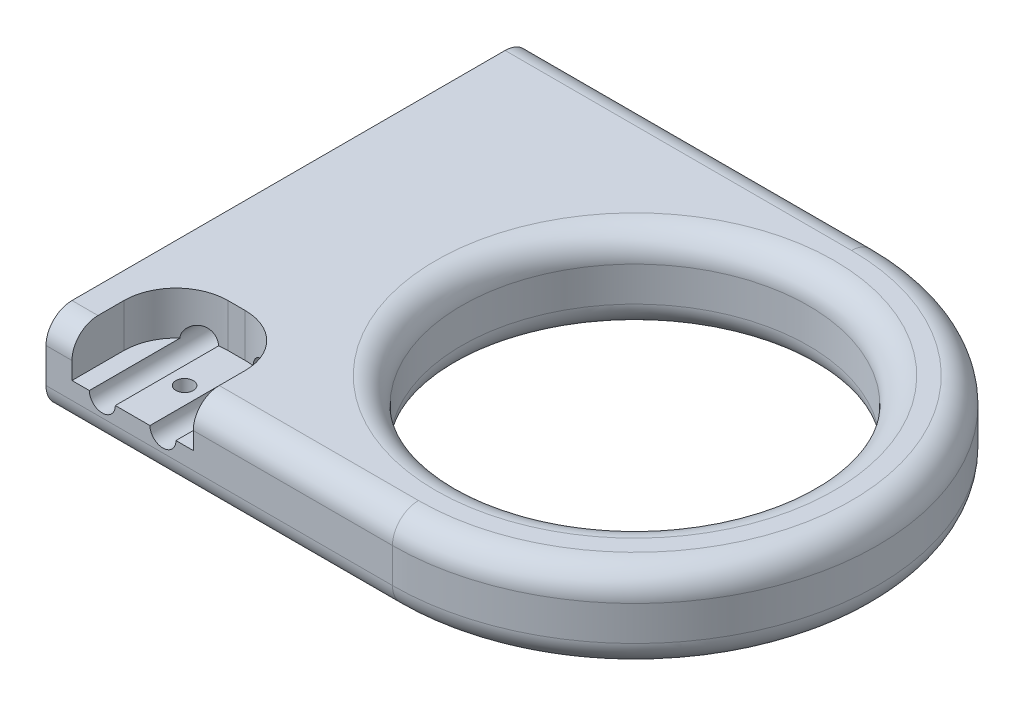
ISO-10303-21;
HEADER;
FILE_DESCRIPTION(('STEP AP214'),'2;1');
FILE_NAME('part.step','',(''),(''),'','','');
FILE_SCHEMA(('AUTOMOTIVE_DESIGN { 1 0 10303 214 1 1 1 1 }'));
ENDSEC;
DATA;
#1=APPLICATION_CONTEXT('core data for automotive mechanical design processes');
#2=APPLICATION_PROTOCOL_DEFINITION('international standard','automotive_design',2000,#1);
#3=PRODUCT_CONTEXT('',#1,'mechanical');
#4=PRODUCT('Part','Part','',(#3));
#5=PRODUCT_RELATED_PRODUCT_CATEGORY('part','',(#4));
#6=PRODUCT_DEFINITION_FORMATION('','',#4);
#7=PRODUCT_DEFINITION_CONTEXT('part definition',#1,'design');
#8=PRODUCT_DEFINITION('design','',#6,#7);
#9=PRODUCT_DEFINITION_SHAPE('','',#8);
#10=(LENGTH_UNIT() NAMED_UNIT(*) SI_UNIT(.MILLI.,.METRE.));
#11=(NAMED_UNIT(*) PLANE_ANGLE_UNIT() SI_UNIT($,.RADIAN.));
#12=(NAMED_UNIT(*) SI_UNIT($,.STERADIAN.) SOLID_ANGLE_UNIT());
#13=UNCERTAINTY_MEASURE_WITH_UNIT(LENGTH_MEASURE(1.E-05),#10,'distance_accuracy_value','');
#14=(GEOMETRIC_REPRESENTATION_CONTEXT(3) GLOBAL_UNCERTAINTY_ASSIGNED_CONTEXT((#13)) GLOBAL_UNIT_ASSIGNED_CONTEXT((#10,
#11,#12)) REPRESENTATION_CONTEXT('',''));
#15=CARTESIAN_POINT('',(0.,0.,0.));
#16=DIRECTION('',(0.,0.,1.));
#17=DIRECTION('',(1.,0.,0.));
#18=AXIS2_PLACEMENT_3D('',#15,#16,#17);
#19=CARTESIAN_POINT('',(0.,2.5,0.));
#20=DIRECTION('',(0.,1.,0.));
#21=DIRECTION('',(0.,0.,1.));
#22=AXIS2_PLACEMENT_3D('',#19,#20,#21);
#23=PLANE('',#22);
#24=DIRECTION('',(0.,0.,1.));
#25=VECTOR('',#24,1.);
#26=CARTESIAN_POINT('',(-20.,2.5,14.));
#27=LINE('',#26,#25);
#28=CARTESIAN_POINT('',(-20.,2.5,-12.5));
#29=VERTEX_POINT('',#28);
#30=CARTESIAN_POINT('',(-20.,2.5,12.5));
#31=VERTEX_POINT('',#30);
#32=EDGE_CURVE('E212',#29,#31,#27,.T.);
#33=ORIENTED_EDGE('',*,*,#32,.T.);
#34=DIRECTION('',(1.,0.,0.));
#35=VECTOR('',#34,1.);
#36=CARTESIAN_POINT('',(-18.5,2.5,12.5));
#37=LINE('',#36,#35);
#38=CARTESIAN_POINT('',(-18.5,2.5,12.5));
#39=VERTEX_POINT('',#38);
#40=EDGE_CURVE('E268',#31,#39,#37,.T.);
#41=ORIENTED_EDGE('',*,*,#40,.T.);
#42=DIRECTION('',(0.,0.,1.));
#43=VECTOR('',#42,1.);
#44=CARTESIAN_POINT('',(-18.5,2.5,8.));
#45=LINE('',#44,#43);
#46=CARTESIAN_POINT('',(-18.5,2.5,11.));
#47=VERTEX_POINT('',#46);
#48=EDGE_CURVE('E438',#47,#39,#45,.T.);
#49=ORIENTED_EDGE('',*,*,#48,.F.);
#50=CARTESIAN_POINT('',(-15.5,2.5,11.));
#51=DIRECTION('',(0.,1.,0.));
#52=DIRECTION('',(0.,0.,1.));
#53=AXIS2_PLACEMENT_3D('',#50,#51,#52);
#54=CIRCLE('',#53,3.);
#55=CARTESIAN_POINT('',(-15.5,2.5,8.));
#56=VERTEX_POINT('',#55);
#57=EDGE_CURVE('E11',#47,#56,#54,.F.);
#58=ORIENTED_EDGE('',*,*,#57,.T.);
#59=DIRECTION('',(-1.,0.,0.));
#60=VECTOR('',#59,1.);
#61=CARTESIAN_POINT('',(0.,2.5,8.));
#62=LINE('',#61,#60);
#63=CARTESIAN_POINT('',(-14.5,2.5,8.));
#64=VERTEX_POINT('',#63);
#65=EDGE_CURVE('E184',#64,#56,#62,.T.);
#66=ORIENTED_EDGE('',*,*,#65,.F.);
#67=CARTESIAN_POINT('',(-14.5,2.5,11.));
#68=DIRECTION('',(0.,1.,0.));
#69=DIRECTION('',(0.,0.,1.));
#70=AXIS2_PLACEMENT_3D('',#67,#68,#69);
#71=CIRCLE('',#70,3.);
#72=CARTESIAN_POINT('',(-11.5,2.5,11.));
#73=VERTEX_POINT('',#72);
#74=EDGE_CURVE('E319',#64,#73,#71,.F.);
#75=ORIENTED_EDGE('',*,*,#74,.T.);
#76=DIRECTION('',(0.,0.,1.));
#77=VECTOR('',#76,1.);
#78=CARTESIAN_POINT('',(-11.5,2.5,8.));
#79=LINE('',#78,#77);
#80=CARTESIAN_POINT('',(-11.5,2.5,12.5));
#81=VERTEX_POINT('',#80);
#82=EDGE_CURVE('E440',#73,#81,#79,.T.);
#83=ORIENTED_EDGE('',*,*,#82,.T.);
#84=DIRECTION('',(1.,0.,0.));
#85=VECTOR('',#84,1.);
#86=CARTESIAN_POINT('',(0.,2.5,12.5));
#87=LINE('',#86,#85);
#88=CARTESIAN_POINT('',(0.,2.5,12.5));
#89=VERTEX_POINT('',#88);
#90=EDGE_CURVE('E265',#81,#89,#87,.T.);
#91=ORIENTED_EDGE('',*,*,#90,.T.);
#92=CARTESIAN_POINT('',(0.,2.5,0.));
#93=DIRECTION('',(0.,1.,0.));
#94=DIRECTION('',(0.,0.,1.));
#95=AXIS2_PLACEMENT_3D('',#92,#93,#94);
#96=CIRCLE('',#95,12.5);
#97=CARTESIAN_POINT('',(0.,2.5,-12.5));
#98=VERTEX_POINT('',#97);
#99=EDGE_CURVE('E261',#89,#98,#96,.T.);
#100=ORIENTED_EDGE('',*,*,#99,.T.);
#101=DIRECTION('',(-1.,0.,0.));
#102=VECTOR('',#101,1.);
#103=CARTESIAN_POINT('',(-20.,2.5,-12.5));
#104=LINE('',#103,#102);
#105=EDGE_CURVE('E263',#98,#29,#104,.T.);
#106=ORIENTED_EDGE('',*,*,#105,.T.);
#107=EDGE_LOOP('',(#33,#41,#49,#58,#66,#75,#83,#91,#100,#106));
#108=FACE_BOUND('',#107,.T.);
#109=CARTESIAN_POINT('',(0.,2.5,0.));
#110=DIRECTION('',(0.,1.,0.));
#111=DIRECTION('',(0.,0.,1.));
#112=AXIS2_PLACEMENT_3D('',#109,#110,#111);
#113=CIRCLE('',#112,11.5);
#114=CARTESIAN_POINT('',(0.,2.5,11.5));
#115=VERTEX_POINT('',#114);
#116=EDGE_CURVE('E258',#115,#115,#113,.F.);
#117=ORIENTED_EDGE('',*,*,#116,.T.);
#118=EDGE_LOOP('',(#117));
#119=FACE_BOUND('',#118,.T.);
#120=ADVANCED_FACE('F41',(#108,#119),#23,.T.);
#121=CARTESIAN_POINT('',(0.,-2.5,0.));
#122=DIRECTION('',(0.,1.,0.));
#123=DIRECTION('',(0.,0.,1.));
#124=AXIS2_PLACEMENT_3D('',#121,#122,#123);
#125=PLANE('',#124);
#126=CARTESIAN_POINT('',(0.,-2.5,0.));
#127=DIRECTION('',(0.,1.,0.));
#128=DIRECTION('',(0.,0.,1.));
#129=AXIS2_PLACEMENT_3D('',#126,#127,#128);
#130=CIRCLE('',#129,11.5);
#131=CARTESIAN_POINT('',(0.,-2.5,11.5));
#132=VERTEX_POINT('',#131);
#133=EDGE_CURVE('E237',#132,#132,#130,.T.);
#134=ORIENTED_EDGE('',*,*,#133,.T.);
#135=EDGE_LOOP('',(#134));
#136=FACE_BOUND('',#135,.T.);
#137=CARTESIAN_POINT('',(-15.,-2.5,11.));
#138=DIRECTION('',(0.,1.,0.));
#139=DIRECTION('',(-1.,0.,0.));
#140=AXIS2_PLACEMENT_3D('',#137,#138,#139);
#141=CIRCLE('',#140,0.500000000000001);
#142=CARTESIAN_POINT('',(-15.5,-2.5,11.));
#143=VERTEX_POINT('',#142);
#144=EDGE_CURVE('E195',#143,#143,#141,.T.);
#145=ORIENTED_EDGE('',*,*,#144,.T.);
#146=EDGE_LOOP('',(#145));
#147=FACE_BOUND('',#146,.T.);
#148=CARTESIAN_POINT('',(0.,-2.5,0.));
#149=DIRECTION('',(0.,1.,0.));
#150=DIRECTION('',(0.,0.,1.));
#151=AXIS2_PLACEMENT_3D('',#148,#149,#150);
#152=CIRCLE('',#151,12.5);
#153=CARTESIAN_POINT('',(0.,-2.5,-12.5));
#154=VERTEX_POINT('',#153);
#155=CARTESIAN_POINT('',(0.,-2.5,12.5));
#156=VERTEX_POINT('',#155);
#157=EDGE_CURVE('E240',#154,#156,#152,.F.);
#158=ORIENTED_EDGE('',*,*,#157,.T.);
#159=DIRECTION('',(1.,0.,0.));
#160=VECTOR('',#159,1.);
#161=CARTESIAN_POINT('',(0.,-2.5,12.5));
#162=LINE('',#161,#160);
#163=CARTESIAN_POINT('',(-20.,-2.5,12.5));
#164=VERTEX_POINT('',#163);
#165=EDGE_CURVE('E244',#156,#164,#162,.F.);
#166=ORIENTED_EDGE('',*,*,#165,.T.);
#167=DIRECTION('',(0.,0.,1.));
#168=VECTOR('',#167,1.);
#169=CARTESIAN_POINT('',(-20.,-2.5,14.));
#170=LINE('',#169,#168);
#171=CARTESIAN_POINT('',(-20.,-2.5,-12.5));
#172=VERTEX_POINT('',#171);
#173=EDGE_CURVE('E216',#172,#164,#170,.T.);
#174=ORIENTED_EDGE('',*,*,#173,.F.);
#175=DIRECTION('',(-1.,0.,0.));
#176=VECTOR('',#175,1.);
#177=CARTESIAN_POINT('',(0.,-2.5,-12.5));
#178=LINE('',#177,#176);
#179=EDGE_CURVE('E242',#172,#154,#178,.F.);
#180=ORIENTED_EDGE('',*,*,#179,.T.);
#181=EDGE_LOOP('',(#158,#166,#174,#180));
#182=FACE_BOUND('',#181,.T.);
#183=ADVANCED_FACE('F369',(#136,#147,#182),#125,.F.);
#184=CARTESIAN_POINT('',(0.,2.5,0.));
#185=DIRECTION('',(0.,-1.,0.));
#186=DIRECTION('',(0.,0.,-1.));
#187=AXIS2_PLACEMENT_3D('',#184,#185,#186);
#188=CYLINDRICAL_SURFACE('',#187,14.);
#189=DIRECTION('',(0.,-1.,0.));
#190=VECTOR('',#189,1.);
#191=CARTESIAN_POINT('',(0.,2.5,14.));
#192=LINE('',#191,#190);
#193=CARTESIAN_POINT('',(0.,1.,14.));
#194=VERTEX_POINT('',#193);
#195=CARTESIAN_POINT('',(0.,-1.,14.));
#196=VERTEX_POINT('',#195);
#197=EDGE_CURVE('E215',#194,#196,#192,.T.);
#198=ORIENTED_EDGE('',*,*,#197,.T.);
#199=CARTESIAN_POINT('',(0.,-1.,0.));
#200=DIRECTION('',(0.,1.,0.));
#201=DIRECTION('',(0.,0.,1.));
#202=AXIS2_PLACEMENT_3D('',#199,#200,#201);
#203=CIRCLE('',#202,14.);
#204=CARTESIAN_POINT('',(0.,-1.,-14.));
#205=VERTEX_POINT('',#204);
#206=EDGE_CURVE('E278',#196,#205,#203,.T.);
#207=ORIENTED_EDGE('',*,*,#206,.T.);
#208=DIRECTION('',(0.,-1.,0.));
#209=VECTOR('',#208,1.);
#210=CARTESIAN_POINT('',(0.,2.5,-14.));
#211=LINE('',#210,#209);
#212=CARTESIAN_POINT('',(0.,1.,-14.));
#213=VERTEX_POINT('',#212);
#214=EDGE_CURVE('E227',#213,#205,#211,.T.);
#215=ORIENTED_EDGE('',*,*,#214,.F.);
#216=CARTESIAN_POINT('',(0.,1.,0.));
#217=DIRECTION('',(0.,1.,0.));
#218=DIRECTION('',(0.,0.,1.));
#219=AXIS2_PLACEMENT_3D('',#216,#217,#218);
#220=CIRCLE('',#219,14.);
#221=EDGE_CURVE('E276',#213,#194,#220,.F.);
#222=ORIENTED_EDGE('',*,*,#221,.T.);
#223=EDGE_LOOP('',(#198,#207,#215,#222));
#224=FACE_BOUND('',#223,.T.);
#225=ADVANCED_FACE('F365',(#224),#188,.T.);
#226=CARTESIAN_POINT('',(-20.,2.5,-14.));
#227=DIRECTION('',(0.,0.,1.));
#228=DIRECTION('',(1.,0.,0.));
#229=AXIS2_PLACEMENT_3D('',#226,#227,#228);
#230=PLANE('',#229);
#231=CARTESIAN_POINT('',(-16.75,0.,-14.));
#232=DIRECTION('',(0.,0.,1.));
#233=DIRECTION('',(1.,0.,0.));
#234=AXIS2_PLACEMENT_3D('',#231,#232,#233);
#235=CIRCLE('',#234,0.750000000000002);
#236=CARTESIAN_POINT('',(-16.,0.,-14.));
#237=VERTEX_POINT('',#236);
#238=EDGE_CURVE('E219',#237,#237,#235,.T.);
#239=ORIENTED_EDGE('',*,*,#238,.T.);
#240=EDGE_LOOP('',(#239));
#241=FACE_BOUND('',#240,.T.);
#242=CARTESIAN_POINT('',(-13.25,0.,-14.));
#243=DIRECTION('',(0.,0.,1.));
#244=DIRECTION('',(1.,0.,0.));
#245=AXIS2_PLACEMENT_3D('',#242,#243,#244);
#246=CIRCLE('',#245,0.75);
#247=CARTESIAN_POINT('',(-12.5,0.,-14.));
#248=VERTEX_POINT('',#247);
#249=EDGE_CURVE('E203',#248,#248,#246,.T.);
#250=ORIENTED_EDGE('',*,*,#249,.T.);
#251=EDGE_LOOP('',(#250));
#252=FACE_BOUND('',#251,.T.);
#253=ORIENTED_EDGE('',*,*,#214,.T.);
#254=DIRECTION('',(-1.,0.,0.));
#255=VECTOR('',#254,1.);
#256=CARTESIAN_POINT('',(-20.,-1.,-14.));
#257=LINE('',#256,#255);
#258=CARTESIAN_POINT('',(-20.,-1.,-14.));
#259=VERTEX_POINT('',#258);
#260=EDGE_CURVE('E256',#205,#259,#257,.T.);
#261=ORIENTED_EDGE('',*,*,#260,.T.);
#262=DIRECTION('',(0.,-1.,0.));
#263=VECTOR('',#262,1.);
#264=CARTESIAN_POINT('',(-20.,2.5,-14.));
#265=LINE('',#264,#263);
#266=CARTESIAN_POINT('',(-20.,1.,-14.));
#267=VERTEX_POINT('',#266);
#268=EDGE_CURVE('E224',#267,#259,#265,.T.);
#269=ORIENTED_EDGE('',*,*,#268,.F.);
#270=DIRECTION('',(-1.,0.,0.));
#271=VECTOR('',#270,1.);
#272=CARTESIAN_POINT('',(0.,1.,-14.));
#273=LINE('',#272,#271);
#274=EDGE_CURVE('E254',#267,#213,#273,.F.);
#275=ORIENTED_EDGE('',*,*,#274,.T.);
#276=EDGE_LOOP('',(#253,#261,#269,#275));
#277=FACE_BOUND('',#276,.T.);
#278=ADVANCED_FACE('F368',(#241,#252,#277),#230,.F.);
#279=CARTESIAN_POINT('',(-20.,2.5,14.));
#280=DIRECTION('',(1.,0.,0.));
#281=DIRECTION('',(0.,0.,-1.));
#282=AXIS2_PLACEMENT_3D('',#279,#280,#281);
#283=PLANE('',#282);
#284=ORIENTED_EDGE('',*,*,#173,.T.);
#285=CARTESIAN_POINT('',(-20.,-1.,12.5));
#286=DIRECTION('',(1.,0.,0.));
#287=DIRECTION('',(0.,0.,-1.));
#288=AXIS2_PLACEMENT_3D('',#285,#286,#287);
#289=CIRCLE('',#288,1.5);
#290=CARTESIAN_POINT('',(-20.,-1.,14.));
#291=VERTEX_POINT('',#290);
#292=EDGE_CURVE('E252',#164,#291,#289,.F.);
#293=ORIENTED_EDGE('',*,*,#292,.T.);
#294=DIRECTION('',(0.,-1.,0.));
#295=VECTOR('',#294,1.);
#296=CARTESIAN_POINT('',(-20.,2.5,14.));
#297=LINE('',#296,#295);
#298=CARTESIAN_POINT('',(-20.,1.,14.));
#299=VERTEX_POINT('',#298);
#300=EDGE_CURVE('E222',#299,#291,#297,.T.);
#301=ORIENTED_EDGE('',*,*,#300,.F.);
#302=CARTESIAN_POINT('',(-20.,1.,12.5));
#303=DIRECTION('',(1.,0.,0.));
#304=DIRECTION('',(0.,0.,-1.));
#305=AXIS2_PLACEMENT_3D('',#302,#303,#304);
#306=CIRCLE('',#305,1.5);
#307=EDGE_CURVE('E246',#299,#31,#306,.F.);
#308=ORIENTED_EDGE('',*,*,#307,.T.);
#309=ORIENTED_EDGE('',*,*,#32,.F.);
#310=CARTESIAN_POINT('',(-20.,1.,-12.5));
#311=DIRECTION('',(1.,0.,0.));
#312=DIRECTION('',(0.,0.,-1.));
#313=AXIS2_PLACEMENT_3D('',#310,#311,#312);
#314=CIRCLE('',#313,1.5);
#315=EDGE_CURVE('E248',#29,#267,#314,.F.);
#316=ORIENTED_EDGE('',*,*,#315,.T.);
#317=ORIENTED_EDGE('',*,*,#268,.T.);
#318=CARTESIAN_POINT('',(-20.,-1.,-12.5));
#319=DIRECTION('',(1.,0.,0.));
#320=DIRECTION('',(0.,0.,-1.));
#321=AXIS2_PLACEMENT_3D('',#318,#319,#320);
#322=CIRCLE('',#321,1.5);
#323=EDGE_CURVE('E250',#259,#172,#322,.F.);
#324=ORIENTED_EDGE('',*,*,#323,.T.);
#325=EDGE_LOOP('',(#284,#293,#301,#308,#309,#316,#317,#324));
#326=FACE_BOUND('',#325,.T.);
#327=ADVANCED_FACE('F373',(#326),#283,.F.);
#328=CARTESIAN_POINT('',(0.,2.5,14.));
#329=DIRECTION('',(0.,0.,-1.));
#330=DIRECTION('',(-1.,0.,0.));
#331=AXIS2_PLACEMENT_3D('',#328,#329,#330);
#332=PLANE('',#331);
#333=ORIENTED_EDGE('',*,*,#300,.T.);
#334=DIRECTION('',(1.,0.,0.));
#335=VECTOR('',#334,1.);
#336=CARTESIAN_POINT('',(0.,-1.,14.));
#337=LINE('',#336,#335);
#338=EDGE_CURVE('E234',#291,#196,#337,.T.);
#339=ORIENTED_EDGE('',*,*,#338,.T.);
#340=ORIENTED_EDGE('',*,*,#197,.F.);
#341=DIRECTION('',(1.,0.,0.));
#342=VECTOR('',#341,1.);
#343=CARTESIAN_POINT('',(-11.5,1.,14.));
#344=LINE('',#343,#342);
#345=CARTESIAN_POINT('',(-11.5,1.,14.));
#346=VERTEX_POINT('',#345);
#347=EDGE_CURVE('E232',#194,#346,#344,.F.);
#348=ORIENTED_EDGE('',*,*,#347,.T.);
#349=DIRECTION('',(0.,-1.,0.));
#350=VECTOR('',#349,1.);
#351=CARTESIAN_POINT('',(-11.5,0.,14.));
#352=LINE('',#351,#350);
#353=CARTESIAN_POINT('',(-11.5,0.,14.));
#354=VERTEX_POINT('',#353);
#355=EDGE_CURVE('E423',#346,#354,#352,.T.);
#356=ORIENTED_EDGE('',*,*,#355,.T.);
#357=DIRECTION('',(1.,0.,0.));
#358=VECTOR('',#357,1.);
#359=CARTESIAN_POINT('',(0.,0.,14.));
#360=LINE('',#359,#358);
#361=CARTESIAN_POINT('',(-12.5,0.,14.));
#362=VERTEX_POINT('',#361);
#363=EDGE_CURVE('E194',#362,#354,#360,.T.);
#364=ORIENTED_EDGE('',*,*,#363,.F.);
#365=CARTESIAN_POINT('',(-13.25,0.,14.));
#366=DIRECTION('',(0.,0.,1.));
#367=DIRECTION('',(1.,0.,0.));
#368=AXIS2_PLACEMENT_3D('',#365,#366,#367);
#369=CIRCLE('',#368,0.75);
#370=CARTESIAN_POINT('',(-14.,0.,14.));
#371=VERTEX_POINT('',#370);
#372=EDGE_CURVE('E178',#371,#362,#369,.T.);
#373=ORIENTED_EDGE('',*,*,#372,.F.);
#374=DIRECTION('',(1.,0.,0.));
#375=VECTOR('',#374,1.);
#376=CARTESIAN_POINT('',(0.,0.,14.));
#377=LINE('',#376,#375);
#378=CARTESIAN_POINT('',(-16.,0.,14.));
#379=VERTEX_POINT('',#378);
#380=EDGE_CURVE('E187',#379,#371,#377,.T.);
#381=ORIENTED_EDGE('',*,*,#380,.F.);
#382=CARTESIAN_POINT('',(-16.75,0.,14.));
#383=DIRECTION('',(0.,0.,1.));
#384=DIRECTION('',(1.,0.,0.));
#385=AXIS2_PLACEMENT_3D('',#382,#383,#384);
#386=CIRCLE('',#385,0.750000000000002);
#387=CARTESIAN_POINT('',(-17.5,0.,14.));
#388=VERTEX_POINT('',#387);
#389=EDGE_CURVE('E206',#388,#379,#386,.T.);
#390=ORIENTED_EDGE('',*,*,#389,.F.);
#391=CARTESIAN_POINT('',(-18.5,0.,14.));
#392=VERTEX_POINT('',#391);
#393=EDGE_CURVE('E197',#392,#388,#377,.T.);
#394=ORIENTED_EDGE('',*,*,#393,.F.);
#395=DIRECTION('',(0.,-1.,0.));
#396=VECTOR('',#395,1.);
#397=CARTESIAN_POINT('',(-18.5,0.,14.));
#398=LINE('',#397,#396);
#399=CARTESIAN_POINT('',(-18.5,1.,14.));
#400=VERTEX_POINT('',#399);
#401=EDGE_CURVE('E429',#400,#392,#398,.T.);
#402=ORIENTED_EDGE('',*,*,#401,.F.);
#403=DIRECTION('',(1.,0.,0.));
#404=VECTOR('',#403,1.);
#405=CARTESIAN_POINT('',(-20.,1.,14.));
#406=LINE('',#405,#404);
#407=EDGE_CURVE('E230',#400,#299,#406,.F.);
#408=ORIENTED_EDGE('',*,*,#407,.T.);
#409=EDGE_LOOP('',(#333,#339,#340,#348,#356,#364,#373,#381,#390,#394,#402,#408));
#410=FACE_BOUND('',#409,.T.);
#411=ADVANCED_FACE('F200',(#410),#332,.F.);
#412=CARTESIAN_POINT('',(0.,2.5,0.));
#413=DIRECTION('',(0.,-1.,0.));
#414=DIRECTION('',(0.,0.,-1.));
#415=AXIS2_PLACEMENT_3D('',#412,#413,#414);
#416=CYLINDRICAL_SURFACE('',#415,10.);
#417=CARTESIAN_POINT('',(0.,-1.,0.));
#418=DIRECTION('',(0.,1.,0.));
#419=DIRECTION('',(0.,0.,1.));
#420=AXIS2_PLACEMENT_3D('',#417,#418,#419);
#421=CIRCLE('',#420,10.);
#422=CARTESIAN_POINT('',(0.,-1.,10.));
#423=VERTEX_POINT('',#422);
#424=EDGE_CURVE('E283',#423,#423,#421,.F.);
#425=ORIENTED_EDGE('',*,*,#424,.T.);
#426=EDGE_LOOP('',(#425));
#427=FACE_BOUND('',#426,.T.);
#428=CARTESIAN_POINT('',(0.,1.,0.));
#429=DIRECTION('',(0.,1.,0.));
#430=DIRECTION('',(0.,0.,1.));
#431=AXIS2_PLACEMENT_3D('',#428,#429,#430);
#432=CIRCLE('',#431,10.);
#433=CARTESIAN_POINT('',(0.,1.,10.));
#434=VERTEX_POINT('',#433);
#435=EDGE_CURVE('E280',#434,#434,#432,.T.);
#436=ORIENTED_EDGE('',*,*,#435,.T.);
#437=EDGE_LOOP('',(#436));
#438=FACE_BOUND('',#437,.T.);
#439=ADVANCED_FACE('F380',(#427,#438),#416,.F.);
#440=CARTESIAN_POINT('',(-13.25,0.,-14.));
#441=DIRECTION('',(0.,0.,1.));
#442=DIRECTION('',(1.,0.,0.));
#443=AXIS2_PLACEMENT_3D('',#440,#441,#442);
#444=CYLINDRICAL_SURFACE('',#443,0.75);
#445=ORIENTED_EDGE('',*,*,#249,.F.);
#446=EDGE_LOOP('',(#445));
#447=FACE_BOUND('',#446,.T.);
#448=DIRECTION('',(0.,0.,1.));
#449=VECTOR('',#448,1.);
#450=CARTESIAN_POINT('',(-12.5,0.,8.));
#451=LINE('',#450,#449);
#452=CARTESIAN_POINT('',(-12.5,0.,8.76393202250021));
#453=VERTEX_POINT('',#452);
#454=EDGE_CURVE('E183',#453,#362,#451,.T.);
#455=ORIENTED_EDGE('',*,*,#454,.F.);
#456=CARTESIAN_POINT('',(-12.5,0.,8.76393202250021));
#457=CARTESIAN_POINT('',(-12.4999976379572,0.0177987631022406,8.76393576302756));
#458=CARTESIAN_POINT('',(-12.5006340741588,0.0355862737600019,8.76336476359866));
#459=CARTESIAN_POINT('',(-12.5031565789653,0.0709857279100747,8.76111170732881));
#460=CARTESIAN_POINT('',(-12.5050415071525,0.0885978167505462,8.75943066444577));
#461=CARTESIAN_POINT('',(-12.512479264493,0.140643022087186,8.75282251881752));
#462=CARTESIAN_POINT('',(-12.5198163489391,0.174644359799823,8.74632875579237));
#463=CARTESIAN_POINT('',(-12.5387368989977,0.240363164732001,8.72984570325058));
#464=CARTESIAN_POINT('',(-12.5503062618047,0.272087803171147,8.71986802780091));
#465=CARTESIAN_POINT('',(-12.5771401847884,0.332971495275426,8.69719307018776));
#466=CARTESIAN_POINT('',(-12.5924149798095,0.362123132452162,8.68448826676196));
#467=CARTESIAN_POINT('',(-12.6327091507,0.428352847876702,8.65178135757734));
#468=CARTESIAN_POINT('',(-12.6592048081762,0.464082764598928,8.63086667730026));
#469=CARTESIAN_POINT('',(-12.7172023316992,0.529667252665866,8.58691889752557));
#470=CARTESIAN_POINT('',(-12.7487091931333,0.559515894116087,8.56388369395219));
#471=CARTESIAN_POINT('',(-12.8163965517051,0.613502872866567,8.51661412216044));
#472=CARTESIAN_POINT('',(-12.8526345771777,0.637558380331181,8.49236773679339));
#473=CARTESIAN_POINT('',(-12.9287536968737,0.679102998822258,8.44398352357866));
#474=CARTESIAN_POINT('',(-12.9686346391882,0.696592383499511,8.41984569124835));
#475=CARTESIAN_POINT('',(-13.0558467536484,0.726047479737102,8.36994177559665));
#476=CARTESIAN_POINT('',(-13.1035167141137,0.737207417880847,8.34428340273958));
#477=CARTESIAN_POINT('',(-13.2012365077772,0.750031197545146,8.29515274565076));
#478=CARTESIAN_POINT('',(-13.2512858571888,0.751696961202218,8.27168001987198));
#479=CARTESIAN_POINT('',(-13.3485504236228,0.744981012078136,8.2292993191665));
#480=CARTESIAN_POINT('',(-13.395722678221,0.737285204793155,8.21018805450269));
#481=CARTESIAN_POINT('',(-13.488788550022,0.712594489688562,8.17512519839466));
#482=CARTESIAN_POINT('',(-13.534683351344,0.695608516891703,8.15917059101094));
#483=CARTESIAN_POINT('',(-13.6179260391346,0.654996255320426,8.13231163401468));
#484=CARTESIAN_POINT('',(-13.6556464015408,0.63237579390944,8.12103525687754));
#485=CARTESIAN_POINT('',(-13.726961931802,0.580473138345576,8.10107203018892));
#486=CARTESIAN_POINT('',(-13.7605589192491,0.551193899017767,8.09238403598378));
#487=CARTESIAN_POINT('',(-13.820156945703,0.489028269385154,8.0778958470068));
#488=CARTESIAN_POINT('',(-13.8465196345753,0.456523753502134,8.0719391855354));
#489=CARTESIAN_POINT('',(-13.8935750407578,0.38737505312661,8.06183216445581));
#490=CARTESIAN_POINT('',(-13.9142665088296,0.350729959067193,8.05768220270343));
#491=CARTESIAN_POINT('',(-13.9489993457137,0.274974900163798,8.05098216269121));
#492=CARTESIAN_POINT('',(-13.9631384273355,0.235911709730646,8.04840837939158));
#493=CARTESIAN_POINT('',(-13.9847640707698,0.155979056095566,8.04455422083765));
#494=CARTESIAN_POINT('',(-13.992261120011,0.115112547751803,8.04327180613948));
#495=CARTESIAN_POINT('',(-13.9987858596575,0.049353642839278,8.04216689777373));
#496=CARTESIAN_POINT('',(-14.0000104239145,0.0246699565011223,8.04196410139742));
#497=CARTESIAN_POINT('',(-14.,0.,8.04196010845015));
#498=B_SPLINE_CURVE_WITH_KNOTS('',3,(#456,#457,#458,#459,#460,#461,#462,#463,#464,#465,#466,
#467,#468,#469,#470,#471,#472,#473,#474,#475,#476,#477,#478,#479,#480,#481,#482,#483,#484,#485,
#486,#487,#488,#489,#490,#491,#492,#493,#494,#495,#496,#497),.UNSPECIFIED.,.F.,.F.,(4,2,2,2,2,2,
2,2,2,2,2,2,2,2,2,2,2,2,2,2,4),(0.,0.0533546976625298,0.106660726311965,0.212211890417141,
0.317414493683834,0.422911055583677,0.569590489281765,0.71641706658489,0.865232579352205,
1.0140418893716,1.17900603833889,1.34393678841705,1.49747790350954,1.65087160604583,
1.78637044900429,1.92180928142332,2.04801685358894,2.1742522040565,2.2985391529095,
2.42262950748565,2.49664432446835),.UNSPECIFIED.);
#499=CARTESIAN_POINT('',(-14.,0.,8.04196010845019));
#500=VERTEX_POINT('',#499);
#501=EDGE_CURVE('E180',#453,#500,#498,.T.);
#502=ORIENTED_EDGE('',*,*,#501,.T.);
#503=DIRECTION('',(0.,0.,1.));
#504=VECTOR('',#503,1.);
#505=CARTESIAN_POINT('',(-14.,0.,8.));
#506=LINE('',#505,#504);
#507=EDGE_CURVE('E173',#500,#371,#506,.T.);
#508=ORIENTED_EDGE('',*,*,#507,.T.);
#509=ORIENTED_EDGE('',*,*,#372,.T.);
#510=EDGE_LOOP('',(#455,#502,#508,#509));
#511=FACE_BOUND('',#510,.T.);
#512=ADVANCED_FACE('F176',(#447,#511),#444,.F.);
#513=CARTESIAN_POINT('',(-16.75,0.,-14.));
#514=DIRECTION('',(0.,0.,1.));
#515=DIRECTION('',(1.,0.,0.));
#516=AXIS2_PLACEMENT_3D('',#513,#514,#515);
#517=CYLINDRICAL_SURFACE('',#516,0.750000000000002);
#518=ORIENTED_EDGE('',*,*,#389,.T.);
#519=DIRECTION('',(0.,0.,1.));
#520=VECTOR('',#519,1.);
#521=CARTESIAN_POINT('',(-16.,0.,8.));
#522=LINE('',#521,#520);
#523=CARTESIAN_POINT('',(-16.,0.,8.04196010845019));
#524=VERTEX_POINT('',#523);
#525=EDGE_CURVE('E190',#524,#379,#522,.T.);
#526=ORIENTED_EDGE('',*,*,#525,.F.);
#527=CARTESIAN_POINT('',(-16.,0.,8.04196010845019));
#528=CARTESIAN_POINT('',(-15.9999615590836,0.0415439605884963,8.04197854667591));
#529=CARTESIAN_POINT('',(-16.0034495068427,0.0830788500486704,8.04254361961867));
#530=CARTESIAN_POINT('',(-16.017198873237,0.164950996122467,8.04490389975844));
#531=CARTESIAN_POINT('',(-16.0274561140343,0.205288975403367,8.04669834824171));
#532=CARTESIAN_POINT('',(-16.054472946127,0.283663797907529,8.05165531405546));
#533=CARTESIAN_POINT('',(-16.0712361708209,0.321699341543945,8.05481859595236));
#534=CARTESIAN_POINT('',(-16.1107076484959,0.394350870007961,8.06274918536806));
#535=CARTESIAN_POINT('',(-16.1334140926701,0.428967890848687,8.06751600497907));
#536=CARTESIAN_POINT('',(-16.1839692547604,0.493755176820111,8.07889525550238));
#537=CARTESIAN_POINT('',(-16.2118073190689,0.523934425907254,8.08550387699265));
#538=CARTESIAN_POINT('',(-16.2717097696676,0.579135150870098,8.10079015795954));
#539=CARTESIAN_POINT('',(-16.3037746189467,0.604156060946441,8.10946804418134));
#540=CARTESIAN_POINT('',(-16.3712050202953,0.648577529112543,8.12907005638634));
#541=CARTESIAN_POINT('',(-16.4065864649097,0.667948983982495,8.14000533483476));
#542=CARTESIAN_POINT('',(-16.4793388645463,0.700594876953742,8.16409388893356));
#543=CARTESIAN_POINT('',(-16.5167099550632,0.713868899226056,8.17724731577227));
#544=CARTESIAN_POINT('',(-16.5937469946081,0.734667749602953,8.20617243458747));
#545=CARTESIAN_POINT('',(-16.6334462772549,0.741956104613067,8.22202434782454));
#546=CARTESIAN_POINT('',(-16.7126673474462,0.750129343721199,8.2556798558759));
#547=CARTESIAN_POINT('',(-16.7521890695843,0.751012035109535,8.27348411687755));
#548=CARTESIAN_POINT('',(-16.8335356607137,0.746540235307534,8.31227157331425));
#549=CARTESIAN_POINT('',(-16.8752621810598,0.740637011961718,8.33339656804577));
#550=CARTESIAN_POINT('',(-16.9565409353415,0.722204980471011,8.37690673790357));
#551=CARTESIAN_POINT('',(-16.9960918571047,0.70967222118262,8.39929265741292));
#552=CARTESIAN_POINT('',(-17.076613365351,0.67670086668351,8.44721269828909));
#553=CARTESIAN_POINT('',(-17.1172433359801,0.655531644696374,8.47281773071213));
#554=CARTESIAN_POINT('',(-17.1941590738474,0.606065014567919,8.52372205847828));
#555=CARTESIAN_POINT('',(-17.2304433204192,0.577765121934379,8.54902124403074));
#556=CARTESIAN_POINT('',(-17.2939714600713,0.517954604001768,8.59520670292955));
#557=CARTESIAN_POINT('',(-17.3217740200832,0.487173077635074,8.61626791557181));
#558=CARTESIAN_POINT('',(-17.3725006008281,0.420410605035808,8.65590647093942));
#559=CARTESIAN_POINT('',(-17.3954307600773,0.384436298118362,8.67448692794883));
#560=CARTESIAN_POINT('',(-17.4309546690755,0.316129752723465,8.70395429523281));
#561=CARTESIAN_POINT('',(-17.4447127912071,0.284747127718343,8.71563409681178));
#562=CARTESIAN_POINT('',(-17.4679950040582,0.219491617866504,8.73566084512907));
#563=CARTESIAN_POINT('',(-17.4775303753966,0.18562565291709,8.7440166653649));
#564=CARTESIAN_POINT('',(-17.4896965888818,0.126390624864204,8.75474837896353));
#565=CARTESIAN_POINT('',(-17.493533325278,0.101452138347468,8.75816026032103));
#566=CARTESIAN_POINT('',(-17.4986972947288,0.0510202528932441,8.76276677637883));
#567=CARTESIAN_POINT('',(-17.500014812301,0.0255250876189459,8.76395282673602));
#568=CARTESIAN_POINT('',(-17.5,0.,8.76393202250021));
#569=B_SPLINE_CURVE_WITH_KNOTS('',3,(#527,#528,#529,#530,#531,#532,#533,#534,#535,#536,#537,
#538,#539,#540,#541,#542,#543,#544,#545,#546,#547,#548,#549,#550,#551,#552,#553,#554,#555,#556,
#557,#558,#559,#560,#561,#562,#563,#564,#565,#566,#567,#568),.UNSPECIFIED.,.F.,.F.,(4,2,2,2,2,2,
2,2,2,2,2,2,2,2,2,2,2,2,2,2,4),(0.,0.124469180840729,0.248861614175123,0.373323617178901,
0.497747784380883,0.621916489369511,0.746098806731977,0.870909985859659,0.995729675520576,
1.12527100770805,1.25485668083465,1.39570446925498,1.5366362964198,1.6934184646474,
1.85025533516589,1.98928935737454,2.12814716454565,2.23634585118713,2.34425372708004,
2.42042320258184,2.49688584130296),.UNSPECIFIED.);
#570=CARTESIAN_POINT('',(-17.5,0.,8.76393202250021));
#571=VERTEX_POINT('',#570);
#572=EDGE_CURVE('E50',#524,#571,#569,.T.);
#573=ORIENTED_EDGE('',*,*,#572,.T.);
#574=DIRECTION('',(0.,0.,1.));
#575=VECTOR('',#574,1.);
#576=CARTESIAN_POINT('',(-17.5,0.,8.));
#577=LINE('',#576,#575);
#578=EDGE_CURVE('E208',#571,#388,#577,.T.);
#579=ORIENTED_EDGE('',*,*,#578,.T.);
#580=EDGE_LOOP('',(#518,#526,#573,#579));
#581=FACE_BOUND('',#580,.T.);
#582=ORIENTED_EDGE('',*,*,#238,.F.);
#583=EDGE_LOOP('',(#582));
#584=FACE_BOUND('',#583,.T.);
#585=ADVANCED_FACE('F391',(#581,#584),#517,.F.);
#586=CARTESIAN_POINT('',(0.,0.,8.));
#587=DIRECTION('',(0.,-1.,0.));
#588=DIRECTION('',(1.,0.,0.));
#589=AXIS2_PLACEMENT_3D('',#586,#587,#588);
#590=PLANE('',#589);
#591=CARTESIAN_POINT('',(-15.,0.,11.));
#592=DIRECTION('',(0.,1.,0.));
#593=DIRECTION('',(-1.,0.,0.));
#594=AXIS2_PLACEMENT_3D('',#591,#592,#593);
#595=CIRCLE('',#594,0.500000000000001);
#596=CARTESIAN_POINT('',(-15.5,0.,11.));
#597=VERTEX_POINT('',#596);
#598=EDGE_CURVE('E293',#597,#597,#595,.T.);
#599=ORIENTED_EDGE('',*,*,#598,.F.);
#600=EDGE_LOOP('',(#599));
#601=FACE_BOUND('',#600,.T.);
#602=ORIENTED_EDGE('',*,*,#507,.F.);
#603=CARTESIAN_POINT('',(-14.5,0.,11.));
#604=DIRECTION('',(0.,-1.,0.));
#605=DIRECTION('',(1.,0.,0.));
#606=AXIS2_PLACEMENT_3D('',#603,#604,#605);
#607=CIRCLE('',#606,3.);
#608=CARTESIAN_POINT('',(-14.5,0.,8.));
#609=VERTEX_POINT('',#608);
#610=EDGE_CURVE('E304',#500,#609,#607,.F.);
#611=ORIENTED_EDGE('',*,*,#610,.T.);
#612=DIRECTION('',(1.,0.,0.));
#613=VECTOR('',#612,1.);
#614=CARTESIAN_POINT('',(0.,0.,8.));
#615=LINE('',#614,#613);
#616=CARTESIAN_POINT('',(-15.5,0.,8.));
#617=VERTEX_POINT('',#616);
#618=EDGE_CURVE('E452',#617,#609,#615,.T.);
#619=ORIENTED_EDGE('',*,*,#618,.F.);
#620=CARTESIAN_POINT('',(-15.5,0.,11.));
#621=DIRECTION('',(0.,-1.,0.));
#622=DIRECTION('',(1.,0.,0.));
#623=AXIS2_PLACEMENT_3D('',#620,#621,#622);
#624=CIRCLE('',#623,3.);
#625=EDGE_CURVE('E302',#617,#524,#624,.F.);
#626=ORIENTED_EDGE('',*,*,#625,.T.);
#627=ORIENTED_EDGE('',*,*,#525,.T.);
#628=ORIENTED_EDGE('',*,*,#380,.T.);
#629=EDGE_LOOP('',(#602,#611,#619,#626,#627,#628));
#630=FACE_BOUND('',#629,.T.);
#631=ADVANCED_FACE('F188',(#601,#630),#590,.F.);
#632=ORIENTED_EDGE('',*,*,#578,.F.);
#633=CARTESIAN_POINT('',(-15.5,0.,11.));
#634=DIRECTION('',(0.,-1.,0.));
#635=DIRECTION('',(1.,0.,0.));
#636=AXIS2_PLACEMENT_3D('',#633,#634,#635);
#637=CIRCLE('',#636,3.);
#638=CARTESIAN_POINT('',(-18.5,0.,11.));
#639=VERTEX_POINT('',#638);
#640=EDGE_CURVE('E65',#571,#639,#637,.F.);
#641=ORIENTED_EDGE('',*,*,#640,.T.);
#642=DIRECTION('',(0.,0.,1.));
#643=VECTOR('',#642,1.);
#644=CARTESIAN_POINT('',(-18.5,0.,8.));
#645=LINE('',#644,#643);
#646=EDGE_CURVE('E436',#639,#392,#645,.T.);
#647=ORIENTED_EDGE('',*,*,#646,.T.);
#648=ORIENTED_EDGE('',*,*,#393,.T.);
#649=EDGE_LOOP('',(#632,#641,#647,#648));
#650=FACE_BOUND('',#649,.T.);
#651=ADVANCED_FACE('F464',(#650),#590,.F.);
#652=CARTESIAN_POINT('',(-18.5,0.,8.));
#653=DIRECTION('',(-1.,0.,0.));
#654=DIRECTION('',(0.,0.,1.));
#655=AXIS2_PLACEMENT_3D('',#652,#653,#654);
#656=PLANE('',#655);
#657=ORIENTED_EDGE('',*,*,#646,.F.);
#658=DIRECTION('',(0.,-1.,0.));
#659=VECTOR('',#658,1.);
#660=CARTESIAN_POINT('',(-18.5,0.,11.));
#661=LINE('',#660,#659);
#662=EDGE_CURVE('E57',#639,#47,#661,.F.);
#663=ORIENTED_EDGE('',*,*,#662,.T.);
#664=ORIENTED_EDGE('',*,*,#48,.T.);
#665=CARTESIAN_POINT('',(-18.5,1.,12.5));
#666=DIRECTION('',(-1.,0.,0.));
#667=DIRECTION('',(0.,0.,1.));
#668=AXIS2_PLACEMENT_3D('',#665,#666,#667);
#669=CIRCLE('',#668,1.5);
#670=EDGE_CURVE('E274',#39,#400,#669,.F.);
#671=ORIENTED_EDGE('',*,*,#670,.T.);
#672=ORIENTED_EDGE('',*,*,#401,.T.);
#673=EDGE_LOOP('',(#657,#663,#664,#671,#672));
#674=FACE_BOUND('',#673,.T.);
#675=ADVANCED_FACE('F470',(#674),#656,.F.);
#676=CARTESIAN_POINT('',(-11.5,0.,8.));
#677=DIRECTION('',(-1.,0.,0.));
#678=DIRECTION('',(0.,0.,1.));
#679=AXIS2_PLACEMENT_3D('',#676,#677,#678);
#680=PLANE('',#679);
#681=ORIENTED_EDGE('',*,*,#82,.F.);
#682=DIRECTION('',(0.,-1.,0.));
#683=VECTOR('',#682,1.);
#684=CARTESIAN_POINT('',(-11.5,0.,11.));
#685=LINE('',#684,#683);
#686=CARTESIAN_POINT('',(-11.5,0.,11.));
#687=VERTEX_POINT('',#686);
#688=EDGE_CURVE('E286',#73,#687,#685,.T.);
#689=ORIENTED_EDGE('',*,*,#688,.T.);
#690=DIRECTION('',(0.,0.,1.));
#691=VECTOR('',#690,1.);
#692=CARTESIAN_POINT('',(-11.5,0.,8.));
#693=LINE('',#692,#691);
#694=EDGE_CURVE('E428',#687,#354,#693,.T.);
#695=ORIENTED_EDGE('',*,*,#694,.T.);
#696=ORIENTED_EDGE('',*,*,#355,.F.);
#697=CARTESIAN_POINT('',(-11.5,1.,12.5));
#698=DIRECTION('',(-1.,0.,0.));
#699=DIRECTION('',(0.,0.,1.));
#700=AXIS2_PLACEMENT_3D('',#697,#698,#699);
#701=CIRCLE('',#700,1.5);
#702=EDGE_CURVE('E271',#346,#81,#701,.T.);
#703=ORIENTED_EDGE('',*,*,#702,.T.);
#704=EDGE_LOOP('',(#681,#689,#695,#696,#703));
#705=FACE_BOUND('',#704,.T.);
#706=ADVANCED_FACE('F426',(#705),#680,.T.);
#707=CARTESIAN_POINT('',(0.,0.,8.));
#708=DIRECTION('',(0.,-1.,0.));
#709=DIRECTION('',(1.,0.,0.));
#710=AXIS2_PLACEMENT_3D('',#707,#708,#709);
#711=PLANE('',#710);
#712=ORIENTED_EDGE('',*,*,#694,.F.);
#713=CARTESIAN_POINT('',(-14.5,0.,11.));
#714=DIRECTION('',(0.,-1.,0.));
#715=DIRECTION('',(1.,0.,0.));
#716=AXIS2_PLACEMENT_3D('',#713,#714,#715);
#717=CIRCLE('',#716,3.);
#718=EDGE_CURVE('E300',#687,#453,#717,.F.);
#719=ORIENTED_EDGE('',*,*,#718,.T.);
#720=ORIENTED_EDGE('',*,*,#454,.T.);
#721=ORIENTED_EDGE('',*,*,#363,.T.);
#722=EDGE_LOOP('',(#712,#719,#720,#721));
#723=FACE_BOUND('',#722,.T.);
#724=ADVANCED_FACE('F479',(#723),#711,.F.);
#725=CARTESIAN_POINT('',(0.,0.,8.));
#726=DIRECTION('',(0.,0.,1.));
#727=DIRECTION('',(1.,0.,0.));
#728=AXIS2_PLACEMENT_3D('',#725,#726,#727);
#729=PLANE('',#728);
#730=ORIENTED_EDGE('',*,*,#618,.T.);
#731=DIRECTION('',(0.,-1.,0.));
#732=VECTOR('',#731,1.);
#733=CARTESIAN_POINT('',(-14.5,2.5,8.));
#734=LINE('',#733,#732);
#735=EDGE_CURVE('E309',#609,#64,#734,.F.);
#736=ORIENTED_EDGE('',*,*,#735,.T.);
#737=ORIENTED_EDGE('',*,*,#65,.T.);
#738=DIRECTION('',(0.,-1.,0.));
#739=VECTOR('',#738,1.);
#740=CARTESIAN_POINT('',(-15.5,0.,8.));
#741=LINE('',#740,#739);
#742=EDGE_CURVE('E306',#56,#617,#741,.T.);
#743=ORIENTED_EDGE('',*,*,#742,.T.);
#744=EDGE_LOOP('',(#730,#736,#737,#743));
#745=FACE_BOUND('',#744,.T.);
#746=ADVANCED_FACE('F473',(#745),#729,.T.);
#747=CARTESIAN_POINT('',(-15.,-2.5,11.));
#748=DIRECTION('',(0.,1.,0.));
#749=DIRECTION('',(-1.,0.,0.));
#750=AXIS2_PLACEMENT_3D('',#747,#748,#749);
#751=CYLINDRICAL_SURFACE('',#750,0.500000000000001);
#752=ORIENTED_EDGE('',*,*,#144,.F.);
#753=EDGE_LOOP('',(#752));
#754=FACE_BOUND('',#753,.T.);
#755=ORIENTED_EDGE('',*,*,#598,.T.);
#756=EDGE_LOOP('',(#755));
#757=FACE_BOUND('',#756,.T.);
#758=ADVANCED_FACE('F357',(#754,#757),#751,.F.);
#759=CARTESIAN_POINT('',(-20.,-1.,-12.5));
#760=DIRECTION('',(-1.,0.,0.));
#761=DIRECTION('',(0.,0.,1.));
#762=AXIS2_PLACEMENT_3D('',#759,#760,#761);
#763=CYLINDRICAL_SURFACE('',#762,1.5);
#764=ORIENTED_EDGE('',*,*,#323,.F.);
#765=ORIENTED_EDGE('',*,*,#260,.F.);
#766=CARTESIAN_POINT('',(0.,-1.,-12.5));
#767=DIRECTION('',(1.,0.,0.));
#768=DIRECTION('',(0.,0.,-1.));
#769=AXIS2_PLACEMENT_3D('',#766,#767,#768);
#770=CIRCLE('',#769,1.5);
#771=EDGE_CURVE('E289',#154,#205,#770,.T.);
#772=ORIENTED_EDGE('',*,*,#771,.F.);
#773=ORIENTED_EDGE('',*,*,#179,.F.);
#774=EDGE_LOOP('',(#764,#765,#772,#773));
#775=FACE_BOUND('',#774,.T.);
#776=ADVANCED_FACE('F353',(#775),#763,.T.);
#777=CARTESIAN_POINT('',(0.,-1.,0.));
#778=DIRECTION('',(0.,1.,0.));
#779=DIRECTION('',(0.,0.,1.));
#780=AXIS2_PLACEMENT_3D('',#777,#778,#779);
#781=TOROIDAL_SURFACE('',#780,12.5,1.5);
#782=ORIENTED_EDGE('',*,*,#771,.T.);
#783=ORIENTED_EDGE('',*,*,#206,.F.);
#784=CARTESIAN_POINT('',(0.,-1.,12.5));
#785=DIRECTION('',(-1.,0.,0.));
#786=DIRECTION('',(0.,0.,1.));
#787=AXIS2_PLACEMENT_3D('',#784,#785,#786);
#788=CIRCLE('',#787,1.5);
#789=EDGE_CURVE('E287',#156,#196,#788,.T.);
#790=ORIENTED_EDGE('',*,*,#789,.F.);
#791=ORIENTED_EDGE('',*,*,#157,.F.);
#792=EDGE_LOOP('',(#782,#783,#790,#791));
#793=FACE_BOUND('',#792,.T.);
#794=ADVANCED_FACE('F356',(#793),#781,.T.);
#795=CARTESIAN_POINT('',(0.,-1.,12.5));
#796=DIRECTION('',(1.,0.,0.));
#797=DIRECTION('',(0.,0.,-1.));
#798=AXIS2_PLACEMENT_3D('',#795,#796,#797);
#799=CYLINDRICAL_SURFACE('',#798,1.5);
#800=ORIENTED_EDGE('',*,*,#292,.F.);
#801=ORIENTED_EDGE('',*,*,#165,.F.);
#802=ORIENTED_EDGE('',*,*,#789,.T.);
#803=ORIENTED_EDGE('',*,*,#338,.F.);
#804=EDGE_LOOP('',(#800,#801,#802,#803));
#805=FACE_BOUND('',#804,.T.);
#806=ADVANCED_FACE('F345',(#805),#799,.T.);
#807=CARTESIAN_POINT('',(0.,1.,-12.5));
#808=DIRECTION('',(1.,0.,0.));
#809=DIRECTION('',(0.,0.,-1.));
#810=AXIS2_PLACEMENT_3D('',#807,#808,#809);
#811=CYLINDRICAL_SURFACE('',#810,1.5);
#812=ORIENTED_EDGE('',*,*,#315,.F.);
#813=ORIENTED_EDGE('',*,*,#105,.F.);
#814=CARTESIAN_POINT('',(0.,1.,-12.5));
#815=DIRECTION('',(1.,0.,0.));
#816=DIRECTION('',(0.,0.,-1.));
#817=AXIS2_PLACEMENT_3D('',#814,#815,#816);
#818=CIRCLE('',#817,1.5);
#819=EDGE_CURVE('E290',#213,#98,#818,.T.);
#820=ORIENTED_EDGE('',*,*,#819,.F.);
#821=ORIENTED_EDGE('',*,*,#274,.F.);
#822=EDGE_LOOP('',(#812,#813,#820,#821));
#823=FACE_BOUND('',#822,.T.);
#824=ADVANCED_FACE('F341',(#823),#811,.T.);
#825=CARTESIAN_POINT('',(0.,1.,0.));
#826=DIRECTION('',(0.,1.,0.));
#827=DIRECTION('',(0.,0.,1.));
#828=AXIS2_PLACEMENT_3D('',#825,#826,#827);
#829=TOROIDAL_SURFACE('',#828,12.5,1.5);
#830=ORIENTED_EDGE('',*,*,#819,.T.);
#831=ORIENTED_EDGE('',*,*,#99,.F.);
#832=CARTESIAN_POINT('',(0.,1.,12.5));
#833=DIRECTION('',(-1.,0.,0.));
#834=DIRECTION('',(0.,-1.,0.));
#835=AXIS2_PLACEMENT_3D('',#832,#833,#834);
#836=CIRCLE('',#835,1.5);
#837=EDGE_CURVE('E294',#194,#89,#836,.T.);
#838=ORIENTED_EDGE('',*,*,#837,.F.);
#839=ORIENTED_EDGE('',*,*,#221,.F.);
#840=EDGE_LOOP('',(#830,#831,#838,#839));
#841=FACE_BOUND('',#840,.T.);
#842=ADVANCED_FACE('F344',(#841),#829,.T.);
#843=CARTESIAN_POINT('',(0.,1.,12.5));
#844=DIRECTION('',(-1.,0.,0.));
#845=DIRECTION('',(0.,0.,1.));
#846=AXIS2_PLACEMENT_3D('',#843,#844,#845);
#847=CYLINDRICAL_SURFACE('',#846,1.5);
#848=ORIENTED_EDGE('',*,*,#702,.F.);
#849=ORIENTED_EDGE('',*,*,#347,.F.);
#850=ORIENTED_EDGE('',*,*,#837,.T.);
#851=ORIENTED_EDGE('',*,*,#90,.F.);
#852=EDGE_LOOP('',(#848,#849,#850,#851));
#853=FACE_BOUND('',#852,.T.);
#854=ADVANCED_FACE('F339',(#853),#847,.T.);
#855=CARTESIAN_POINT('',(0.,1.,12.5));
#856=DIRECTION('',(-1.,0.,0.));
#857=DIRECTION('',(0.,0.,1.));
#858=AXIS2_PLACEMENT_3D('',#855,#856,#857);
#859=CYLINDRICAL_SURFACE('',#858,1.5);
#860=ORIENTED_EDGE('',*,*,#307,.F.);
#861=ORIENTED_EDGE('',*,*,#407,.F.);
#862=ORIENTED_EDGE('',*,*,#670,.F.);
#863=ORIENTED_EDGE('',*,*,#40,.F.);
#864=EDGE_LOOP('',(#860,#861,#862,#863));
#865=FACE_BOUND('',#864,.T.);
#866=ADVANCED_FACE('F335',(#865),#859,.T.);
#867=CARTESIAN_POINT('',(0.,-1.,0.));
#868=DIRECTION('',(0.,1.,0.));
#869=DIRECTION('',(0.,0.,1.));
#870=AXIS2_PLACEMENT_3D('',#867,#868,#869);
#871=TOROIDAL_SURFACE('',#870,11.5,1.5);
#872=ORIENTED_EDGE('',*,*,#424,.F.);
#873=EDGE_LOOP('',(#872));
#874=FACE_BOUND('',#873,.T.);
#875=ORIENTED_EDGE('',*,*,#133,.F.);
#876=EDGE_LOOP('',(#875));
#877=FACE_BOUND('',#876,.T.);
#878=ADVANCED_FACE('F331',(#874,#877),#871,.T.);
#879=CARTESIAN_POINT('',(0.,1.,0.));
#880=DIRECTION('',(0.,1.,0.));
#881=DIRECTION('',(0.,0.,1.));
#882=AXIS2_PLACEMENT_3D('',#879,#880,#881);
#883=TOROIDAL_SURFACE('',#882,11.5,1.5);
#884=ORIENTED_EDGE('',*,*,#116,.F.);
#885=EDGE_LOOP('',(#884));
#886=FACE_BOUND('',#885,.T.);
#887=ORIENTED_EDGE('',*,*,#435,.F.);
#888=EDGE_LOOP('',(#887));
#889=FACE_BOUND('',#888,.T.);
#890=ADVANCED_FACE('F327',(#886,#889),#883,.T.);
#891=CARTESIAN_POINT('',(-14.5,0.,11.));
#892=DIRECTION('',(0.,1.,0.));
#893=DIRECTION('',(0.,0.,1.));
#894=AXIS2_PLACEMENT_3D('',#891,#892,#893);
#895=CYLINDRICAL_SURFACE('',#894,3.);
#896=ORIENTED_EDGE('',*,*,#74,.F.);
#897=ORIENTED_EDGE('',*,*,#735,.F.);
#898=ORIENTED_EDGE('',*,*,#610,.F.);
#899=ORIENTED_EDGE('',*,*,#501,.F.);
#900=ORIENTED_EDGE('',*,*,#718,.F.);
#901=ORIENTED_EDGE('',*,*,#688,.F.);
#902=EDGE_LOOP('',(#896,#897,#898,#899,#900,#901));
#903=FACE_BOUND('',#902,.T.);
#904=ADVANCED_FACE('F323',(#903),#895,.F.);
#905=CARTESIAN_POINT('',(-15.5,0.,11.));
#906=DIRECTION('',(0.,-1.,0.));
#907=DIRECTION('',(0.,0.,-1.));
#908=AXIS2_PLACEMENT_3D('',#905,#906,#907);
#909=CYLINDRICAL_SURFACE('',#908,3.);
#910=ORIENTED_EDGE('',*,*,#57,.F.);
#911=ORIENTED_EDGE('',*,*,#662,.F.);
#912=ORIENTED_EDGE('',*,*,#640,.F.);
#913=ORIENTED_EDGE('',*,*,#572,.F.);
#914=ORIENTED_EDGE('',*,*,#625,.F.);
#915=ORIENTED_EDGE('',*,*,#742,.F.);
#916=EDGE_LOOP('',(#910,#911,#912,#913,#914,#915));
#917=FACE_BOUND('',#916,.T.);
#918=ADVANCED_FACE('F43',(#917),#909,.F.);
#919=CLOSED_SHELL('',(#120,#183,#225,#278,#327,#411,#439,#512,#585,#631,#651,#675,#706,#724,
#746,#758,#776,#794,#806,#824,#842,#854,#866,#878,#890,#904,#918));
#920=MANIFOLD_SOLID_BREP('B2',#919);
#921=ADVANCED_BREP_SHAPE_REPRESENTATION('',(#18,#920),#14);
#922=SHAPE_DEFINITION_REPRESENTATION(#9,#921);
ENDSEC;
END-ISO-10303-21;
